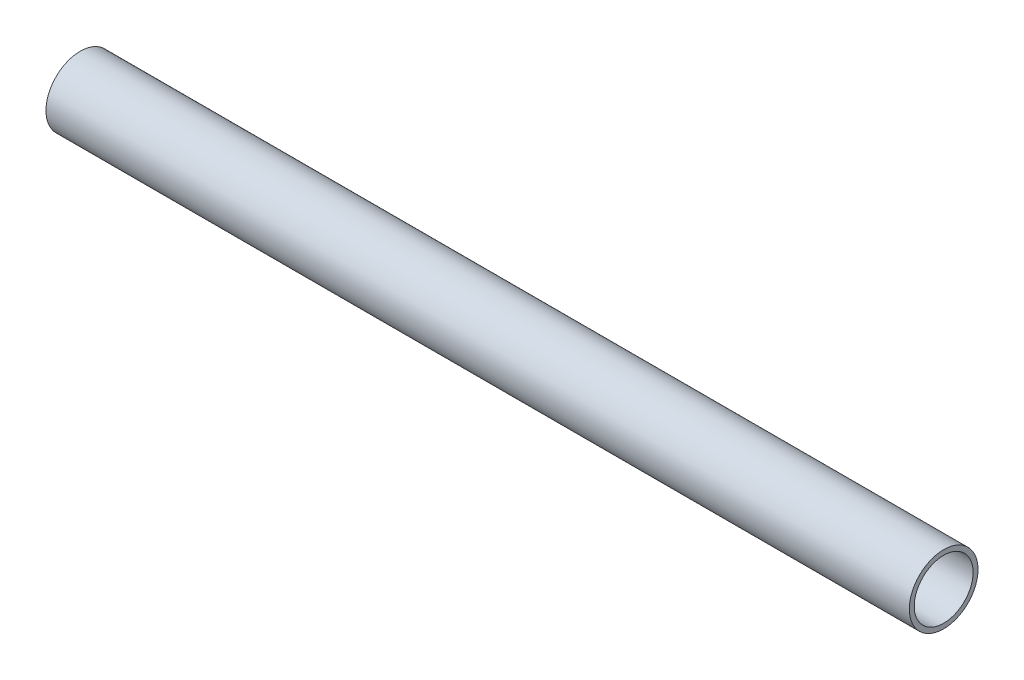
ISO-10303-21;
HEADER;
FILE_DESCRIPTION(('STEP AP214'),'2;1');
FILE_NAME('part.step','',(''),(''),'','','');
FILE_SCHEMA(('AUTOMOTIVE_DESIGN { 1 0 10303 214 1 1 1 1 }'));
ENDSEC;
DATA;
#1=APPLICATION_CONTEXT('core data for automotive mechanical design processes');
#2=APPLICATION_PROTOCOL_DEFINITION('international standard','automotive_design',2000,#1);
#3=PRODUCT_CONTEXT('',#1,'mechanical');
#4=PRODUCT('Part','Part','',(#3));
#5=PRODUCT_RELATED_PRODUCT_CATEGORY('part','',(#4));
#6=PRODUCT_DEFINITION_FORMATION('','',#4);
#7=PRODUCT_DEFINITION_CONTEXT('part definition',#1,'design');
#8=PRODUCT_DEFINITION('design','',#6,#7);
#9=PRODUCT_DEFINITION_SHAPE('','',#8);
#10=(LENGTH_UNIT() NAMED_UNIT(*) SI_UNIT(.MILLI.,.METRE.));
#11=(NAMED_UNIT(*) PLANE_ANGLE_UNIT() SI_UNIT($,.RADIAN.));
#12=(NAMED_UNIT(*) SI_UNIT($,.STERADIAN.) SOLID_ANGLE_UNIT());
#13=UNCERTAINTY_MEASURE_WITH_UNIT(LENGTH_MEASURE(1.E-05),#10,'distance_accuracy_value','');
#14=(GEOMETRIC_REPRESENTATION_CONTEXT(3) GLOBAL_UNCERTAINTY_ASSIGNED_CONTEXT((#13)) GLOBAL_UNIT_ASSIGNED_CONTEXT((#10,
#11,#12)) REPRESENTATION_CONTEXT('',''));
#15=CARTESIAN_POINT('',(0.,0.,0.));
#16=DIRECTION('',(0.,0.,1.));
#17=DIRECTION('',(1.,0.,0.));
#18=AXIS2_PLACEMENT_3D('',#15,#16,#17);
#19=CARTESIAN_POINT('',(139.7,0.,0.));
#20=DIRECTION('',(1.,0.,0.));
#21=DIRECTION('',(0.,0.,-1.));
#22=AXIS2_PLACEMENT_3D('',#19,#20,#21);
#23=PLANE('',#22);
#24=CARTESIAN_POINT('',(139.7,0.,0.));
#25=DIRECTION('',(1.,0.,0.));
#26=DIRECTION('',(0.,0.,-1.));
#27=AXIS2_PLACEMENT_3D('',#24,#25,#26);
#28=CIRCLE('',#27,11.1125);
#29=CARTESIAN_POINT('',(139.7,0.,-11.1125));
#30=VERTEX_POINT('',#29);
#31=EDGE_CURVE('E10',#30,#30,#28,.T.);
#32=ORIENTED_EDGE('',*,*,#31,.T.);
#33=EDGE_LOOP('',(#32));
#34=FACE_BOUND('',#33,.T.);
#35=CARTESIAN_POINT('',(139.7,0.,0.));
#36=DIRECTION('',(1.,0.,0.));
#37=DIRECTION('',(0.,0.,-1.));
#38=AXIS2_PLACEMENT_3D('',#35,#36,#37);
#39=CIRCLE('',#38,9.525);
#40=CARTESIAN_POINT('',(139.7,0.,-9.525));
#41=VERTEX_POINT('',#40);
#42=EDGE_CURVE('E54',#41,#41,#39,.T.);
#43=ORIENTED_EDGE('',*,*,#42,.F.);
#44=EDGE_LOOP('',(#43));
#45=FACE_BOUND('',#44,.T.);
#46=ADVANCED_FACE('F41',(#34,#45),#23,.T.);
#47=CARTESIAN_POINT('',(-139.7,0.,0.));
#48=DIRECTION('',(1.,0.,0.));
#49=DIRECTION('',(0.,0.,-1.));
#50=AXIS2_PLACEMENT_3D('',#47,#48,#49);
#51=PLANE('',#50);
#52=CARTESIAN_POINT('',(-139.7,0.,0.));
#53=DIRECTION('',(1.,0.,0.));
#54=DIRECTION('',(0.,0.,-1.));
#55=AXIS2_PLACEMENT_3D('',#52,#53,#54);
#56=CIRCLE('',#55,11.1125);
#57=CARTESIAN_POINT('',(-139.7,0.,-11.1125));
#58=VERTEX_POINT('',#57);
#59=EDGE_CURVE('E45',#58,#58,#56,.T.);
#60=ORIENTED_EDGE('',*,*,#59,.F.);
#61=EDGE_LOOP('',(#60));
#62=FACE_BOUND('',#61,.T.);
#63=CARTESIAN_POINT('',(-139.7,0.,0.));
#64=DIRECTION('',(1.,0.,0.));
#65=DIRECTION('',(0.,0.,-1.));
#66=AXIS2_PLACEMENT_3D('',#63,#64,#65);
#67=CIRCLE('',#66,9.525);
#68=CARTESIAN_POINT('',(-139.7,0.,-9.525));
#69=VERTEX_POINT('',#68);
#70=EDGE_CURVE('E56',#69,#69,#67,.T.);
#71=ORIENTED_EDGE('',*,*,#70,.T.);
#72=EDGE_LOOP('',(#71));
#73=FACE_BOUND('',#72,.T.);
#74=ADVANCED_FACE('F68',(#62,#73),#51,.F.);
#75=CARTESIAN_POINT('',(139.7,0.,0.));
#76=DIRECTION('',(-1.,0.,0.));
#77=DIRECTION('',(0.,0.,1.));
#78=AXIS2_PLACEMENT_3D('',#75,#76,#77);
#79=CYLINDRICAL_SURFACE('',#78,11.1125);
#80=ORIENTED_EDGE('',*,*,#31,.F.);
#81=EDGE_LOOP('',(#80));
#82=FACE_BOUND('',#81,.T.);
#83=ORIENTED_EDGE('',*,*,#59,.T.);
#84=EDGE_LOOP('',(#83));
#85=FACE_BOUND('',#84,.T.);
#86=ADVANCED_FACE('F43',(#82,#85),#79,.T.);
#87=CARTESIAN_POINT('',(139.7,0.,0.));
#88=DIRECTION('',(-1.,0.,0.));
#89=DIRECTION('',(0.,0.,1.));
#90=AXIS2_PLACEMENT_3D('',#87,#88,#89);
#91=CYLINDRICAL_SURFACE('',#90,9.525);
#92=ORIENTED_EDGE('',*,*,#42,.T.);
#93=EDGE_LOOP('',(#92));
#94=FACE_BOUND('',#93,.T.);
#95=ORIENTED_EDGE('',*,*,#70,.F.);
#96=EDGE_LOOP('',(#95));
#97=FACE_BOUND('',#96,.T.);
#98=ADVANCED_FACE('F64',(#94,#97),#91,.F.);
#99=CLOSED_SHELL('',(#46,#74,#86,#98));
#100=MANIFOLD_SOLID_BREP('B2',#99);
#101=ADVANCED_BREP_SHAPE_REPRESENTATION('',(#18,#100),#14);
#102=SHAPE_DEFINITION_REPRESENTATION(#9,#101);
ENDSEC;
END-ISO-10303-21;
